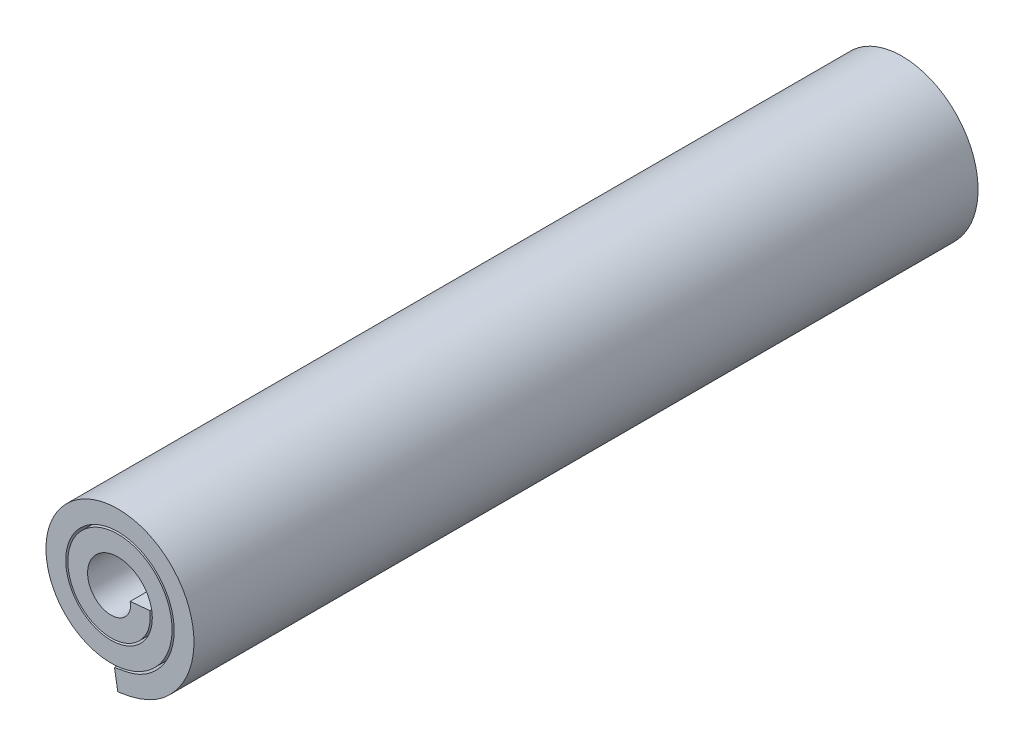
ISO-10303-21;
HEADER;
FILE_DESCRIPTION(('STEP AP214'),'2;1');
FILE_NAME('part.step','',(''),(''),'','','');
FILE_SCHEMA(('AUTOMOTIVE_DESIGN { 1 0 10303 214 1 1 1 1 }'));
ENDSEC;
DATA;
#1=APPLICATION_CONTEXT('core data for automotive mechanical design processes');
#2=APPLICATION_PROTOCOL_DEFINITION('international standard','automotive_design',2000,#1);
#3=PRODUCT_CONTEXT('',#1,'mechanical');
#4=PRODUCT('Part','Part','',(#3));
#5=PRODUCT_RELATED_PRODUCT_CATEGORY('part','',(#4));
#6=PRODUCT_DEFINITION_FORMATION('','',#4);
#7=PRODUCT_DEFINITION_CONTEXT('part definition',#1,'design');
#8=PRODUCT_DEFINITION('design','',#6,#7);
#9=PRODUCT_DEFINITION_SHAPE('','',#8);
#10=(LENGTH_UNIT() NAMED_UNIT(*) SI_UNIT(.MILLI.,.METRE.));
#11=(NAMED_UNIT(*) PLANE_ANGLE_UNIT() SI_UNIT($,.RADIAN.));
#12=(NAMED_UNIT(*) SI_UNIT($,.STERADIAN.) SOLID_ANGLE_UNIT());
#13=UNCERTAINTY_MEASURE_WITH_UNIT(LENGTH_MEASURE(1.E-05),#10,'distance_accuracy_value','');
#14=(GEOMETRIC_REPRESENTATION_CONTEXT(3) GLOBAL_UNCERTAINTY_ASSIGNED_CONTEXT((#13)) GLOBAL_UNIT_ASSIGNED_CONTEXT((#10,
#11,#12)) REPRESENTATION_CONTEXT('',''));
#15=CARTESIAN_POINT('',(0.,0.,0.));
#16=DIRECTION('',(0.,0.,1.));
#17=DIRECTION('',(1.,0.,0.));
#18=AXIS2_PLACEMENT_3D('',#15,#16,#17);
#19=CARTESIAN_POINT('',(0.499999999999983,0.,0.));
#20=DIRECTION('',(0.0937922385048884,-0.995591791848568,0.));
#21=DIRECTION('',(0.995591791848568,0.0937922385048885,0.));
#22=AXIS2_PLACEMENT_3D('',#19,#20,#21);
#23=PLANE('',#22);
#24=DIRECTION('',(-0.995591791848568,-0.0937922385048885,0.));
#25=VECTOR('',#24,1.);
#26=CARTESIAN_POINT('',(1.12722282886458,0.0590891102580785,0.));
#27=LINE('',#26,#25);
#28=CARTESIAN_POINT('',(1.12722282886458,0.0590891102580785,0.));
#29=VERTEX_POINT('',#28);
#30=CARTESIAN_POINT('',(0.499999999999983,0.,0.));
#31=VERTEX_POINT('',#30);
#32=EDGE_CURVE('E76',#29,#31,#27,.T.);
#33=ORIENTED_EDGE('',*,*,#32,.F.);
#34=DIRECTION('',(0.,0.,1.));
#35=VECTOR('',#34,1.);
#36=CARTESIAN_POINT('',(1.12722282886459,0.0590891102580791,-25.));
#37=LINE('',#36,#35);
#38=CARTESIAN_POINT('',(1.12722282886459,0.0590891102580791,-25.));
#39=VERTEX_POINT('',#38);
#40=EDGE_CURVE('E102',#39,#29,#37,.T.);
#41=ORIENTED_EDGE('',*,*,#40,.F.);
#42=DIRECTION('',(0.995591791848568,0.0937922385048885,0.));
#43=VECTOR('',#42,1.);
#44=CARTESIAN_POINT('',(0.499999999999986,0.,-25.));
#45=LINE('',#44,#43);
#46=CARTESIAN_POINT('',(0.499999999999986,0.,-25.));
#47=VERTEX_POINT('',#46);
#48=EDGE_CURVE('E77',#47,#39,#45,.T.);
#49=ORIENTED_EDGE('',*,*,#48,.F.);
#50=DIRECTION('',(0.,0.,-1.));
#51=VECTOR('',#50,1.);
#52=CARTESIAN_POINT('',(0.499999999999983,0.,0.));
#53=LINE('',#52,#51);
#54=EDGE_CURVE('E74',#31,#47,#53,.T.);
#55=ORIENTED_EDGE('',*,*,#54,.F.);
#56=EDGE_LOOP('',(#33,#41,#49,#55));
#57=FACE_BOUND('',#56,.T.);
#58=ADVANCED_FACE('F33',(#57),#23,.F.);
#59=CARTESIAN_POINT('',(0.,-2.075,0.));
#60=DIRECTION('',(-0.986101513551397,-0.166143928482638,0.));
#61=DIRECTION('',(0.166143928482638,-0.986101513551397,0.));
#62=AXIS2_PLACEMENT_3D('',#59,#60,#61);
#63=PLANE('',#62);
#64=DIRECTION('',(-0.166143928482638,0.986101513551397,0.));
#65=VECTOR('',#64,1.);
#66=CARTESIAN_POINT('',(0.104670674943996,-2.69624395353738,0.));
#67=LINE('',#66,#65);
#68=CARTESIAN_POINT('',(0.104670674943996,-2.69624395353738,0.));
#69=VERTEX_POINT('',#68);
#70=CARTESIAN_POINT('',(0.,-2.075,0.));
#71=VERTEX_POINT('',#70);
#72=EDGE_CURVE('E93',#69,#71,#67,.T.);
#73=ORIENTED_EDGE('',*,*,#72,.T.);
#74=DIRECTION('',(0.,0.,-1.));
#75=VECTOR('',#74,1.);
#76=CARTESIAN_POINT('',(0.,-2.075,0.));
#77=LINE('',#76,#75);
#78=CARTESIAN_POINT('',(0.,-2.075,-25.));
#79=VERTEX_POINT('',#78);
#80=EDGE_CURVE('E92',#71,#79,#77,.T.);
#81=ORIENTED_EDGE('',*,*,#80,.T.);
#82=DIRECTION('',(0.166143928482638,-0.986101513551397,0.));
#83=VECTOR('',#82,1.);
#84=CARTESIAN_POINT('',(0.,-2.075,-25.));
#85=LINE('',#84,#83);
#86=CARTESIAN_POINT('',(0.104670674943997,-2.69624395353738,-25.));
#87=VERTEX_POINT('',#86);
#88=EDGE_CURVE('E41',#79,#87,#85,.T.);
#89=ORIENTED_EDGE('',*,*,#88,.T.);
#90=DIRECTION('',(0.,0.,1.));
#91=VECTOR('',#90,1.);
#92=CARTESIAN_POINT('',(0.104670674943997,-2.69624395353738,-25.));
#93=LINE('',#92,#91);
#94=EDGE_CURVE('E11',#87,#69,#93,.T.);
#95=ORIENTED_EDGE('',*,*,#94,.T.);
#96=EDGE_LOOP('',(#73,#81,#89,#95));
#97=FACE_BOUND('',#96,.T.);
#98=ADVANCED_FACE('F124',(#97),#63,.T.);
#99=CARTESIAN_POINT('',(0.,-2.075,-25.));
#100=CARTESIAN_POINT('',(0.191979122898397,-2.04255455965042,-25.));
#101=CARTESIAN_POINT('',(0.58961328567229,-1.97535237998395,-25.));
#102=CARTESIAN_POINT('',(1.02373521008562,-1.76587334130241,-25.));
#103=CARTESIAN_POINT('',(1.36271708763674,-1.46938130820576,-25.));
#104=CARTESIAN_POINT('',(1.60114532698387,-1.16725818916722,-25.));
#105=CARTESIAN_POINT('',(1.77767549349336,-0.828162738983051,-25.));
#106=CARTESIAN_POINT('',(1.88353579986627,-0.461601955854315,-25.));
#107=CARTESIAN_POINT('',(1.91582688563732,-0.0796298419358635,-25.));
#108=CARTESIAN_POINT('',(1.87108564136869,0.300170476217156,-25.));
#109=CARTESIAN_POINT('',(1.75113198425042,0.664044844493022,-25.));
#110=CARTESIAN_POINT('',(1.55929323721311,0.995038924615031,-25.));
#111=CARTESIAN_POINT('',(1.30782497665277,1.27541359816311,-25.));
#112=CARTESIAN_POINT('',(1.00973898516544,1.49401115992098,-25.));
#113=CARTESIAN_POINT('',(0.679842236066423,1.646303293234,-25.));
#114=CARTESIAN_POINT('',(0.32554667187205,1.72768846616353,-25.));
#115=CARTESIAN_POINT('',(-0.0375967611253286,1.73502012248365,-25.));
#116=CARTESIAN_POINT('',(-0.394812969400935,1.66564946311879,-25.));
#117=CARTESIAN_POINT('',(-0.728719505577525,1.52307552409814,-25.));
#118=CARTESIAN_POINT('',(-1.02498854097518,1.31118729727892,-25.));
#119=CARTESIAN_POINT('',(-1.2673785196567,1.04090383805359,-25.));
#120=CARTESIAN_POINT('',(-1.4447764371545,0.722605765512491,-25.));
#121=CARTESIAN_POINT('',(-1.54568612342397,0.373516329412341,-25.));
#122=CARTESIAN_POINT('',(-1.56495600184155,0.00990192243496311,-25.));
#123=CARTESIAN_POINT('',(-1.49890885612183,-0.348208696749193,-25.));
#124=CARTESIAN_POINT('',(-1.3510166382196,-0.680450051108161,-25.));
#125=CARTESIAN_POINT('',(-1.12703268379356,-0.968329706167473,-25.));
#126=CARTESIAN_POINT('',(-0.840084356061241,-1.19222550202165,-25.));
#127=CARTESIAN_POINT('',(-0.518616821228081,-1.33296092165241,-25.));
#128=CARTESIAN_POINT('',(-0.186265382380022,-1.3898134184995,-25.));
#129=CARTESIAN_POINT('',(0.13612784101064,-1.36991499199628,-25.));
#130=CARTESIAN_POINT('',(0.446010939695411,-1.27479571716864,-25.));
#131=CARTESIAN_POINT('',(0.723489519581017,-1.10846763766277,-25.));
#132=CARTESIAN_POINT('',(0.9525561064144,-0.87989695834652,-25.));
#133=CARTESIAN_POINT('',(1.09930717348759,-0.631364308233585,-25.));
#134=CARTESIAN_POINT('',(1.1780064829771,-0.394234023272569,-25.));
#135=CARTESIAN_POINT('',(1.20933515031558,-0.180929964689105,-25.));
#136=CARTESIAN_POINT('',(1.20292118446566,0.0336389222108388,-25.));
#137=CARTESIAN_POINT('',(1.15779787971842,0.244243900690417,-25.));
#138=CARTESIAN_POINT('',(1.07559561113039,0.442950234088985,-25.));
#139=CARTESIAN_POINT('',(0.95766948520535,0.622915972216931,-25.));
#140=CARTESIAN_POINT('',(0.808103322363776,0.77784487510924,-25.));
#141=CARTESIAN_POINT('',(0.631572598318882,0.900723440908225,-25.));
#142=CARTESIAN_POINT('',(0.434188243948875,0.987205940567142,-25.));
#143=CARTESIAN_POINT('',(0.223716889389367,1.03207470783211,-25.));
#144=CARTESIAN_POINT('',(0.00823158804945417,1.03349756069774,-25.));
#145=CARTESIAN_POINT('',(-0.202761615892395,0.989540183770991,-25.));
#146=CARTESIAN_POINT('',(-0.399494567552331,0.902054563227515,-25.));
#147=CARTESIAN_POINT('',(-0.57269823512236,0.772989140378816,-25.));
#148=CARTESIAN_POINT('',(-0.712213560391472,0.609184013537867,-25.));
#149=CARTESIAN_POINT('',(-0.810748832016377,0.416604568011872,-25.));
#150=CARTESIAN_POINT('',(-0.860565152233857,0.206973374233351,-25.));
#151=CARTESIAN_POINT('',(-0.858242328116945,0.00891915237071739,-25.));
#152=CARTESIAN_POINT('',(-0.81637488832565,-0.165288586283552,-25.));
#153=CARTESIAN_POINT('',(-0.749146681453405,-0.312053021141878,-25.));
#154=CARTESIAN_POINT('',(-0.653528465640274,-0.442450130732647,-25.));
#155=CARTESIAN_POINT('',(-0.53357400078122,-0.550448501430655,-25.));
#156=CARTESIAN_POINT('',(-0.392802707917104,-0.630631809759926,-25.));
#157=CARTESIAN_POINT('',(-0.238595536919297,-0.678166334330086,-25.));
#158=CARTESIAN_POINT('',(-0.0766809237945586,-0.689524408301166,-25.));
#159=CARTESIAN_POINT('',(0.0767071343405846,-0.663702847433186,-25.));
#160=CARTESIAN_POINT('',(0.215110670857113,-0.605499036500482,-25.));
#161=CARTESIAN_POINT('',(0.330225942184191,-0.521750258554842,-25.));
#162=CARTESIAN_POINT('',(0.425885474129058,-0.411109801634576,-25.));
#163=CARTESIAN_POINT('',(0.491924437399513,-0.277027383794773,-25.));
#164=CARTESIAN_POINT('',(0.513688780798657,-0.163769779584466,-25.));
#165=CARTESIAN_POINT('',(0.504189194007997,-0.0501186620940827,-25.));
#166=CARTESIAN_POINT('',(0.499999999999986,0.,-25.));
#167=CARTESIAN_POINT('',(0.,-2.075,0.));
#168=CARTESIAN_POINT('',(0.191979122898397,-2.04255455965042,0.));
#169=CARTESIAN_POINT('',(0.589613285672289,-1.97535237998394,0.));
#170=CARTESIAN_POINT('',(1.02373521008562,-1.7658733413024,0.));
#171=CARTESIAN_POINT('',(1.36271708763674,-1.46938130820576,0.));
#172=CARTESIAN_POINT('',(1.60114532698387,-1.16725818916722,0.));
#173=CARTESIAN_POINT('',(1.77767549349335,-0.82816273898305,0.));
#174=CARTESIAN_POINT('',(1.88353579986627,-0.461601955854315,0.));
#175=CARTESIAN_POINT('',(1.91582688563732,-0.0796298419358634,0.));
#176=CARTESIAN_POINT('',(1.87108564136868,0.300170476217155,0.));
#177=CARTESIAN_POINT('',(1.75113198425042,0.664044844493021,0.));
#178=CARTESIAN_POINT('',(1.5592932372131,0.995038924615029,0.));
#179=CARTESIAN_POINT('',(1.30782497665277,1.27541359816311,0.));
#180=CARTESIAN_POINT('',(1.00973898516544,1.49401115992097,0.));
#181=CARTESIAN_POINT('',(0.679842236066422,1.64630329323399,0.));
#182=CARTESIAN_POINT('',(0.325546671872049,1.72768846616353,0.));
#183=CARTESIAN_POINT('',(-0.0375967611253284,1.73502012248365,0.));
#184=CARTESIAN_POINT('',(-0.394812969400934,1.66564946311879,0.));
#185=CARTESIAN_POINT('',(-0.728719505577523,1.52307552409814,0.));
#186=CARTESIAN_POINT('',(-1.02498854097518,1.31118729727892,0.));
#187=CARTESIAN_POINT('',(-1.2673785196567,1.04090383805359,0.));
#188=CARTESIAN_POINT('',(-1.4447764371545,0.72260576551249,0.));
#189=CARTESIAN_POINT('',(-1.54568612342397,0.373516329412341,0.));
#190=CARTESIAN_POINT('',(-1.56495600184155,0.0099019224349633,0.));
#191=CARTESIAN_POINT('',(-1.49890885612182,-0.348208696749192,0.));
#192=CARTESIAN_POINT('',(-1.3510166382196,-0.68045005110816,0.));
#193=CARTESIAN_POINT('',(-1.12703268379356,-0.968329706167471,0.));
#194=CARTESIAN_POINT('',(-0.840084356061239,-1.19222550202165,0.));
#195=CARTESIAN_POINT('',(-0.518616821228081,-1.3329609216524,0.));
#196=CARTESIAN_POINT('',(-0.186265382380021,-1.3898134184995,0.));
#197=CARTESIAN_POINT('',(0.136127841010639,-1.36991499199628,0.));
#198=CARTESIAN_POINT('',(0.446010939695409,-1.27479571716864,0.));
#199=CARTESIAN_POINT('',(0.723489519581015,-1.10846763766276,0.));
#200=CARTESIAN_POINT('',(0.952556106414397,-0.879896958346519,0.));
#201=CARTESIAN_POINT('',(1.09930717348759,-0.631364308233584,0.));
#202=CARTESIAN_POINT('',(1.1780064829771,-0.394234023272569,0.));
#203=CARTESIAN_POINT('',(1.20933515031558,-0.180929964689105,0.));
#204=CARTESIAN_POINT('',(1.20292118446566,0.0336389222108384,0.));
#205=CARTESIAN_POINT('',(1.15779787971842,0.244243900690416,0.));
#206=CARTESIAN_POINT('',(1.07559561113039,0.442950234088984,0.));
#207=CARTESIAN_POINT('',(0.957669485205348,0.622915972216929,0.));
#208=CARTESIAN_POINT('',(0.808103322363774,0.777844875109238,0.));
#209=CARTESIAN_POINT('',(0.63157259831888,0.900723440908222,0.));
#210=CARTESIAN_POINT('',(0.434188243948874,0.987205940567139,0.));
#211=CARTESIAN_POINT('',(0.223716889389367,1.03207470783211,0.));
#212=CARTESIAN_POINT('',(0.00823158804945449,1.03349756069774,0.));
#213=CARTESIAN_POINT('',(-0.202761615892394,0.989540183770988,0.));
#214=CARTESIAN_POINT('',(-0.399494567552329,0.902054563227512,0.));
#215=CARTESIAN_POINT('',(-0.572698235122358,0.772989140378814,0.));
#216=CARTESIAN_POINT('',(-0.71221356039147,0.609184013537866,0.));
#217=CARTESIAN_POINT('',(-0.810748832016374,0.41660456801187,0.));
#218=CARTESIAN_POINT('',(-0.860565152233854,0.20697337423335,0.));
#219=CARTESIAN_POINT('',(-0.858242328116942,0.00891915237071773,0.));
#220=CARTESIAN_POINT('',(-0.816374888325647,-0.165288586283551,0.));
#221=CARTESIAN_POINT('',(-0.749146681453402,-0.312053021141876,0.));
#222=CARTESIAN_POINT('',(-0.653528465640271,-0.442450130732645,0.));
#223=CARTESIAN_POINT('',(-0.533574000781219,-0.550448501430653,0.));
#224=CARTESIAN_POINT('',(-0.392802707917103,-0.630631809759923,0.));
#225=CARTESIAN_POINT('',(-0.238595536919296,-0.678166334330083,0.));
#226=CARTESIAN_POINT('',(-0.0766809237945586,-0.689524408301163,0.));
#227=CARTESIAN_POINT('',(0.0767071343405838,-0.663702847433183,0.));
#228=CARTESIAN_POINT('',(0.215110670857111,-0.605499036500478,0.));
#229=CARTESIAN_POINT('',(0.330225942184189,-0.52175025855484,0.));
#230=CARTESIAN_POINT('',(0.425885474129055,-0.411109801634575,0.));
#231=CARTESIAN_POINT('',(0.491924437399511,-0.277027383794771,0.));
#232=CARTESIAN_POINT('',(0.513688780798654,-0.163769779584466,0.));
#233=CARTESIAN_POINT('',(0.504189194007994,-0.050118662094083,0.));
#234=CARTESIAN_POINT('',(0.499999999999983,0.,0.));
#235=B_SPLINE_SURFACE_WITH_KNOTS('',1,3,((#99,#100,#101,#102,#103,#104,#105,#106,#107,#108,#109,
#110,#111,#112,#113,#114,#115,#116,#117,#118,#119,#120,#121,#122,#123,#124,#125,#126,#127,#128,
#129,#130,#131,#132,#133,#134,#135,#136,#137,#138,#139,#140,#141,#142,#143,#144,#145,#146,#147,
#148,#149,#150,#151,#152,#153,#154,#155,#156,#157,#158,#159,#160,#161,#162,#163,#164,#165,#166),
(#167,#168,#169,#170,#171,#172,#173,#174,#175,#176,#177,#178,#179,#180,#181,#182,#183,#184,#185,
#186,#187,#188,#189,#190,#191,#192,#193,#194,#195,#196,#197,#198,#199,#200,#201,#202,#203,#204,
#205,#206,#207,#208,#209,#210,#211,#212,#213,#214,#215,#216,#217,#218,#219,#220,#221,#222,#223,
#224,#225,#226,#227,#228,#229,#230,#231,#232,#233,#234)),.UNSPECIFIED.,.F.,.F.,.F.,(2,2),(4,1,1,
1,1,1,1,1,1,1,1,1,1,1,1,1,1,1,1,1,1,1,1,1,1,1,1,1,1,1,1,1,1,1,1,1,1,1,1,1,1,1,1,1,1,1,1,1,1,1,1,
1,1,1,1,1,1,1,1,1,1,1,1,1,1,4),(0.512290284822474,1.),(0.,0.0276569759900053,0.0572841376010448,
0.0770949744957778,0.0967597680103298,0.116415852282449,0.136148048198849,0.155909148840344,
0.175705715870728,0.195509397802657,0.215352550148176,0.235219213079138,0.254113940035531,
0.273033783418019,0.291983749686718,0.310967613632046,0.32997661067976,0.349029878285721,
0.368102917991534,0.387230030820004,0.406376032697237,0.425579888296524,0.444813728221296,
0.464094704110151,0.483429294655977,0.502795548731436,0.522230214549338,0.541713456634357,
0.559082357396024,0.576515108363195,0.593980454966659,0.611515722392399,0.629105647751169,
0.646745443333069,0.658575807940051,0.670418854043581,0.682308775655792,0.694223222117301,
0.706177566782933,0.718171192783669,0.730199913918089,0.742278717618551,0.75439386335455,
0.766565271773404,0.778780945688554,0.791054534540864,0.803388394676819,0.815776095406598,
0.828245582709591,0.840769254156808,0.853391352253893,0.86609111072931,0.875689655898569,
0.885348695848098,0.895070773671186,0.904865877022695,0.914729592397221,0.924686066490103,
0.93472054206472,0.944880728702389,0.953998873927047,0.963220386755095,0.97247748227852,
0.982095296293533,0.992104258939337,1.),.UNSPECIFIED.);
#236=CARTESIAN_POINT('',(0.,-2.075,0.));
#237=CARTESIAN_POINT('',(0.191979122898397,-2.04255455965042,0.));
#238=CARTESIAN_POINT('',(0.58961328567229,-1.97535237998394,0.));
#239=CARTESIAN_POINT('',(1.02373521008562,-1.7658733413024,0.));
#240=CARTESIAN_POINT('',(1.36271708763674,-1.46938130820576,0.));
#241=CARTESIAN_POINT('',(1.60114532698387,-1.16725818916722,0.));
#242=CARTESIAN_POINT('',(1.77767549349335,-0.82816273898305,0.));
#243=CARTESIAN_POINT('',(1.88353579986627,-0.461601955854315,0.));
#244=CARTESIAN_POINT('',(1.91582688563732,-0.0796298419358634,0.));
#245=CARTESIAN_POINT('',(1.87108564136868,0.300170476217155,0.));
#246=CARTESIAN_POINT('',(1.75113198425042,0.664044844493021,0.));
#247=CARTESIAN_POINT('',(1.5592932372131,0.995038924615029,0.));
#248=CARTESIAN_POINT('',(1.30782497665277,1.27541359816311,0.));
#249=CARTESIAN_POINT('',(1.00973898516544,1.49401115992097,0.));
#250=CARTESIAN_POINT('',(0.679842236066422,1.64630329323399,0.));
#251=CARTESIAN_POINT('',(0.325546671872049,1.72768846616353,0.));
#252=CARTESIAN_POINT('',(-0.0375967611253284,1.73502012248365,0.));
#253=CARTESIAN_POINT('',(-0.394812969400934,1.66564946311879,0.));
#254=CARTESIAN_POINT('',(-0.728719505577523,1.52307552409814,0.));
#255=CARTESIAN_POINT('',(-1.02498854097518,1.31118729727892,0.));
#256=CARTESIAN_POINT('',(-1.2673785196567,1.04090383805359,0.));
#257=CARTESIAN_POINT('',(-1.4447764371545,0.72260576551249,0.));
#258=CARTESIAN_POINT('',(-1.54568612342397,0.373516329412341,0.));
#259=CARTESIAN_POINT('',(-1.56495600184155,0.0099019224349633,0.));
#260=CARTESIAN_POINT('',(-1.49890885612182,-0.348208696749192,0.));
#261=CARTESIAN_POINT('',(-1.3510166382196,-0.68045005110816,0.));
#262=CARTESIAN_POINT('',(-1.12703268379356,-0.968329706167471,0.));
#263=CARTESIAN_POINT('',(-0.840084356061239,-1.19222550202165,0.));
#264=CARTESIAN_POINT('',(-0.518616821228081,-1.3329609216524,0.));
#265=CARTESIAN_POINT('',(-0.186265382380021,-1.3898134184995,0.));
#266=CARTESIAN_POINT('',(0.136127841010639,-1.36991499199628,0.));
#267=CARTESIAN_POINT('',(0.446010939695409,-1.27479571716864,0.));
#268=CARTESIAN_POINT('',(0.723489519581015,-1.10846763766276,0.));
#269=CARTESIAN_POINT('',(0.952556106414397,-0.879896958346518,0.));
#270=CARTESIAN_POINT('',(1.09930717348759,-0.631364308233584,0.));
#271=CARTESIAN_POINT('',(1.1780064829771,-0.394234023272569,0.));
#272=CARTESIAN_POINT('',(1.20933515031558,-0.180929964689105,0.));
#273=CARTESIAN_POINT('',(1.20292118446566,0.0336389222108385,0.));
#274=CARTESIAN_POINT('',(1.15779787971842,0.244243900690416,0.));
#275=CARTESIAN_POINT('',(1.07559561113039,0.442950234088984,0.));
#276=CARTESIAN_POINT('',(0.957669485205348,0.622915972216929,0.));
#277=CARTESIAN_POINT('',(0.808103322363774,0.777844875109238,0.));
#278=CARTESIAN_POINT('',(0.63157259831888,0.900723440908222,0.));
#279=CARTESIAN_POINT('',(0.434188243948874,0.987205940567139,0.));
#280=CARTESIAN_POINT('',(0.223716889389367,1.03207470783211,0.));
#281=CARTESIAN_POINT('',(0.00823158804945449,1.03349756069774,0.));
#282=CARTESIAN_POINT('',(-0.202761615892394,0.989540183770988,0.));
#283=CARTESIAN_POINT('',(-0.399494567552329,0.902054563227512,0.));
#284=CARTESIAN_POINT('',(-0.572698235122358,0.772989140378814,0.));
#285=CARTESIAN_POINT('',(-0.71221356039147,0.609184013537866,0.));
#286=CARTESIAN_POINT('',(-0.810748832016374,0.41660456801187,0.));
#287=CARTESIAN_POINT('',(-0.860565152233854,0.20697337423335,0.));
#288=CARTESIAN_POINT('',(-0.858242328116942,0.00891915237071772,0.));
#289=CARTESIAN_POINT('',(-0.816374888325647,-0.165288586283551,0.));
#290=CARTESIAN_POINT('',(-0.749146681453402,-0.312053021141876,0.));
#291=CARTESIAN_POINT('',(-0.653528465640271,-0.442450130732645,0.));
#292=CARTESIAN_POINT('',(-0.533574000781219,-0.550448501430653,0.));
#293=CARTESIAN_POINT('',(-0.392802707917103,-0.630631809759923,0.));
#294=CARTESIAN_POINT('',(-0.238595536919296,-0.678166334330083,0.));
#295=CARTESIAN_POINT('',(-0.0766809237945586,-0.689524408301163,0.));
#296=CARTESIAN_POINT('',(0.0767071343405837,-0.663702847433183,0.));
#297=CARTESIAN_POINT('',(0.215110670857111,-0.605499036500478,0.));
#298=CARTESIAN_POINT('',(0.330225942184189,-0.52175025855484,0.));
#299=CARTESIAN_POINT('',(0.425885474129055,-0.411109801634575,0.));
#300=CARTESIAN_POINT('',(0.491924437399511,-0.277027383794771,0.));
#301=CARTESIAN_POINT('',(0.513688780798654,-0.163769779584466,0.));
#302=CARTESIAN_POINT('',(0.504189194007994,-0.0501186620940829,0.));
#303=CARTESIAN_POINT('',(0.499999999999983,0.,0.));
#304=B_SPLINE_CURVE_WITH_KNOTS('',3,(#236,#237,#238,#239,#240,#241,#242,#243,#244,#245,#246,
#247,#248,#249,#250,#251,#252,#253,#254,#255,#256,#257,#258,#259,#260,#261,#262,#263,#264,#265,
#266,#267,#268,#269,#270,#271,#272,#273,#274,#275,#276,#277,#278,#279,#280,#281,#282,#283,#284,
#285,#286,#287,#288,#289,#290,#291,#292,#293,#294,#295,#296,#297,#298,#299,#300,#301,#302,#303),
.UNSPECIFIED.,.F.,.F.,(4,1,1,1,1,1,1,1,1,1,1,1,1,1,1,1,1,1,1,1,1,1,1,1,1,1,1,1,1,1,1,1,1,1,1,1,
1,1,1,1,1,1,1,1,1,1,1,1,1,1,1,1,1,1,1,1,1,1,1,1,1,1,1,1,1,4),(0.,0.0276569759900053,
0.0572841376010448,0.0770949744957778,0.0967597680103298,0.116415852282449,0.136148048198849,
0.155909148840344,0.175705715870728,0.195509397802657,0.215352550148176,0.235219213079138,
0.254113940035531,0.273033783418019,0.291983749686718,0.310967613632046,0.32997661067976,
0.349029878285721,0.368102917991534,0.387230030820004,0.406376032697237,0.425579888296524,
0.444813728221296,0.464094704110151,0.483429294655977,0.502795548731436,0.522230214549338,
0.541713456634357,0.559082357396024,0.576515108363195,0.593980454966659,0.611515722392399,
0.629105647751169,0.646745443333069,0.658575807940051,0.670418854043581,0.682308775655792,
0.694223222117301,0.706177566782933,0.718171192783669,0.730199913918089,0.742278717618551,
0.75439386335455,0.766565271773404,0.778780945688554,0.791054534540864,0.803388394676819,
0.815776095406598,0.828245582709591,0.840769254156808,0.853391352253893,0.86609111072931,
0.875689655898569,0.885348695848098,0.895070773671186,0.904865877022695,0.914729592397221,
0.924686066490103,0.93472054206472,0.944880728702389,0.953998873927047,0.963220386755095,
0.97247748227852,0.982095296293533,0.992104258939337,1.),.UNSPECIFIED.);
#305=EDGE_CURVE('E85',#71,#31,#304,.T.);
#306=CARTESIAN_POINT('',(0.,-2.075,-25.));
#307=CARTESIAN_POINT('',(0.191979122898397,-2.04255455965042,-25.));
#308=CARTESIAN_POINT('',(0.58961328567229,-1.97535237998395,-25.));
#309=CARTESIAN_POINT('',(1.02373521008562,-1.76587334130241,-25.));
#310=CARTESIAN_POINT('',(1.36271708763674,-1.46938130820576,-25.));
#311=CARTESIAN_POINT('',(1.60114532698387,-1.16725818916722,-25.));
#312=CARTESIAN_POINT('',(1.77767549349336,-0.828162738983051,-25.));
#313=CARTESIAN_POINT('',(1.88353579986627,-0.461601955854315,-25.));
#314=CARTESIAN_POINT('',(1.91582688563732,-0.0796298419358635,-25.));
#315=CARTESIAN_POINT('',(1.87108564136869,0.300170476217156,-25.));
#316=CARTESIAN_POINT('',(1.75113198425042,0.664044844493022,-25.));
#317=CARTESIAN_POINT('',(1.55929323721311,0.995038924615031,-25.));
#318=CARTESIAN_POINT('',(1.30782497665277,1.27541359816311,-25.));
#319=CARTESIAN_POINT('',(1.00973898516544,1.49401115992098,-25.));
#320=CARTESIAN_POINT('',(0.679842236066423,1.646303293234,-25.));
#321=CARTESIAN_POINT('',(0.32554667187205,1.72768846616353,-25.));
#322=CARTESIAN_POINT('',(-0.0375967611253286,1.73502012248365,-25.));
#323=CARTESIAN_POINT('',(-0.394812969400935,1.66564946311879,-25.));
#324=CARTESIAN_POINT('',(-0.728719505577525,1.52307552409814,-25.));
#325=CARTESIAN_POINT('',(-1.02498854097518,1.31118729727892,-25.));
#326=CARTESIAN_POINT('',(-1.2673785196567,1.04090383805359,-25.));
#327=CARTESIAN_POINT('',(-1.4447764371545,0.722605765512491,-25.));
#328=CARTESIAN_POINT('',(-1.54568612342397,0.373516329412341,-25.));
#329=CARTESIAN_POINT('',(-1.56495600184155,0.00990192243496311,-25.));
#330=CARTESIAN_POINT('',(-1.49890885612183,-0.348208696749193,-25.));
#331=CARTESIAN_POINT('',(-1.3510166382196,-0.680450051108161,-25.));
#332=CARTESIAN_POINT('',(-1.12703268379356,-0.968329706167473,-25.));
#333=CARTESIAN_POINT('',(-0.840084356061241,-1.19222550202165,-25.));
#334=CARTESIAN_POINT('',(-0.518616821228081,-1.33296092165241,-25.));
#335=CARTESIAN_POINT('',(-0.186265382380022,-1.3898134184995,-25.));
#336=CARTESIAN_POINT('',(0.13612784101064,-1.36991499199628,-25.));
#337=CARTESIAN_POINT('',(0.446010939695411,-1.27479571716864,-25.));
#338=CARTESIAN_POINT('',(0.723489519581017,-1.10846763766277,-25.));
#339=CARTESIAN_POINT('',(0.9525561064144,-0.87989695834652,-25.));
#340=CARTESIAN_POINT('',(1.09930717348759,-0.631364308233585,-25.));
#341=CARTESIAN_POINT('',(1.1780064829771,-0.394234023272569,-25.));
#342=CARTESIAN_POINT('',(1.20933515031558,-0.180929964689105,-25.));
#343=CARTESIAN_POINT('',(1.20292118446566,0.0336389222108388,-25.));
#344=CARTESIAN_POINT('',(1.15779787971842,0.244243900690417,-25.));
#345=CARTESIAN_POINT('',(1.07559561113039,0.442950234088985,-25.));
#346=CARTESIAN_POINT('',(0.95766948520535,0.622915972216931,-25.));
#347=CARTESIAN_POINT('',(0.808103322363776,0.77784487510924,-25.));
#348=CARTESIAN_POINT('',(0.631572598318882,0.900723440908225,-25.));
#349=CARTESIAN_POINT('',(0.434188243948875,0.987205940567142,-25.));
#350=CARTESIAN_POINT('',(0.223716889389367,1.03207470783211,-25.));
#351=CARTESIAN_POINT('',(0.00823158804945417,1.03349756069774,-25.));
#352=CARTESIAN_POINT('',(-0.202761615892395,0.989540183770991,-25.));
#353=CARTESIAN_POINT('',(-0.399494567552331,0.902054563227515,-25.));
#354=CARTESIAN_POINT('',(-0.57269823512236,0.772989140378816,-25.));
#355=CARTESIAN_POINT('',(-0.712213560391472,0.609184013537867,-25.));
#356=CARTESIAN_POINT('',(-0.810748832016377,0.416604568011872,-25.));
#357=CARTESIAN_POINT('',(-0.860565152233857,0.206973374233351,-25.));
#358=CARTESIAN_POINT('',(-0.858242328116945,0.00891915237071739,-25.));
#359=CARTESIAN_POINT('',(-0.81637488832565,-0.165288586283552,-25.));
#360=CARTESIAN_POINT('',(-0.749146681453405,-0.312053021141878,-25.));
#361=CARTESIAN_POINT('',(-0.653528465640274,-0.442450130732647,-25.));
#362=CARTESIAN_POINT('',(-0.53357400078122,-0.550448501430655,-25.));
#363=CARTESIAN_POINT('',(-0.392802707917104,-0.630631809759926,-25.));
#364=CARTESIAN_POINT('',(-0.238595536919297,-0.678166334330086,-25.));
#365=CARTESIAN_POINT('',(-0.0766809237945586,-0.689524408301166,-25.));
#366=CARTESIAN_POINT('',(0.0767071343405846,-0.663702847433186,-25.));
#367=CARTESIAN_POINT('',(0.215110670857113,-0.605499036500482,-25.));
#368=CARTESIAN_POINT('',(0.330225942184191,-0.521750258554842,-25.));
#369=CARTESIAN_POINT('',(0.425885474129058,-0.411109801634576,-25.));
#370=CARTESIAN_POINT('',(0.491924437399513,-0.277027383794773,-25.));
#371=CARTESIAN_POINT('',(0.513688780798657,-0.163769779584466,-25.));
#372=CARTESIAN_POINT('',(0.504189194007997,-0.0501186620940827,-25.));
#373=CARTESIAN_POINT('',(0.499999999999986,0.,-25.));
#374=B_SPLINE_CURVE_WITH_KNOTS('',3,(#306,#307,#308,#309,#310,#311,#312,#313,#314,#315,#316,
#317,#318,#319,#320,#321,#322,#323,#324,#325,#326,#327,#328,#329,#330,#331,#332,#333,#334,#335,
#336,#337,#338,#339,#340,#341,#342,#343,#344,#345,#346,#347,#348,#349,#350,#351,#352,#353,#354,
#355,#356,#357,#358,#359,#360,#361,#362,#363,#364,#365,#366,#367,#368,#369,#370,#371,#372,#373),
.UNSPECIFIED.,.F.,.F.,(4,1,1,1,1,1,1,1,1,1,1,1,1,1,1,1,1,1,1,1,1,1,1,1,1,1,1,1,1,1,1,1,1,1,1,1,
1,1,1,1,1,1,1,1,1,1,1,1,1,1,1,1,1,1,1,1,1,1,1,1,1,1,1,1,1,4),(0.,0.0276569759900053,
0.0572841376010448,0.0770949744957778,0.0967597680103298,0.116415852282449,0.136148048198849,
0.155909148840344,0.175705715870728,0.195509397802657,0.215352550148176,0.235219213079138,
0.254113940035531,0.273033783418019,0.291983749686718,0.310967613632046,0.32997661067976,
0.349029878285721,0.368102917991534,0.387230030820004,0.406376032697237,0.425579888296524,
0.444813728221296,0.464094704110151,0.483429294655977,0.502795548731436,0.522230214549338,
0.541713456634357,0.559082357396024,0.576515108363195,0.593980454966659,0.611515722392399,
0.629105647751169,0.646745443333069,0.658575807940051,0.670418854043581,0.682308775655792,
0.694223222117301,0.706177566782933,0.718171192783669,0.730199913918089,0.742278717618551,
0.75439386335455,0.766565271773404,0.778780945688554,0.791054534540864,0.803388394676819,
0.815776095406598,0.828245582709591,0.840769254156808,0.853391352253893,0.86609111072931,
0.875689655898569,0.885348695848098,0.895070773671186,0.904865877022695,0.914729592397221,
0.924686066490103,0.93472054206472,0.944880728702389,0.953998873927047,0.963220386755095,
0.97247748227852,0.982095296293533,0.992104258939337,1.),.UNSPECIFIED.);
#375=EDGE_CURVE('E94',#79,#47,#374,.T.);
#376=ORIENTED_EDGE('',*,*,#80,.F.);
#377=ORIENTED_EDGE('',*,*,#305,.T.);
#378=ORIENTED_EDGE('',*,*,#54,.T.);
#379=ORIENTED_EDGE('',*,*,#375,.F.);
#380=EDGE_LOOP('',(#376,#377,#378,#379));
#381=FACE_BOUND('',#380,.T.);
#382=ADVANCED_FACE('F90',(#381),#235,.T.);
#383=CARTESIAN_POINT('',(0.104670674943997,-2.69624395353738,-25.));
#384=DIRECTION('',(0.,0.,-1.));
#385=DIRECTION('',(-0.166143928482638,0.986101513551397,0.));
#386=AXIS2_PLACEMENT_3D('',#383,#384,#385);
#387=PLANE('',#386);
#388=ORIENTED_EDGE('',*,*,#88,.F.);
#389=ORIENTED_EDGE('',*,*,#375,.T.);
#390=ORIENTED_EDGE('',*,*,#48,.T.);
#391=CARTESIAN_POINT('',(0.104670674943997,-2.69624395353738,-25.));
#392=CARTESIAN_POINT('',(0.313102709136811,-2.66280100700738,-25.));
#393=CARTESIAN_POINT('',(0.744814741988185,-2.59353275615084,-25.));
#394=CARTESIAN_POINT('',(1.38302749218008,-2.29499952223955,-25.));
#395=CARTESIAN_POINT('',(1.82113178235789,-1.90543602445656,-25.));
#396=CARTESIAN_POINT('',(2.13282142235184,-1.51252851742942,-25.));
#397=CARTESIAN_POINT('',(2.36610142686903,-1.06447977254424,-25.));
#398=CARTESIAN_POINT('',(2.50722572800129,-0.576325016749735,-25.));
#399=CARTESIAN_POINT('',(2.5499505648438,-0.0700465791641838,-25.));
#400=CARTESIAN_POINT('',(2.49041525371168,0.437400215067976,-25.));
#401=CARTESIAN_POINT('',(2.33019065825374,0.923221706912044,-25.));
#402=CARTESIAN_POINT('',(2.07274944611835,1.36791346199745,-25.));
#403=CARTESIAN_POINT('',(1.73454587580744,1.74486845382658,-25.));
#404=CARTESIAN_POINT('',(1.33205701963402,2.04034723635642,-25.));
#405=CARTESIAN_POINT('',(0.885088289428743,2.24657858867001,-25.));
#406=CARTESIAN_POINT('',(0.403883188824104,2.35739871959501,-25.));
#407=CARTESIAN_POINT('',(-0.0920925270855571,2.36730640695239,-25.));
#408=CARTESIAN_POINT('',(-0.580217610485604,2.27279009457498,-25.));
#409=CARTESIAN_POINT('',(-1.04023906498413,2.07630351527282,-25.));
#410=CARTESIAN_POINT('',(-1.44780015190014,1.78506522948632,-25.));
#411=CARTESIAN_POINT('',(-1.78475666613427,1.40947932066958,-25.));
#412=CARTESIAN_POINT('',(-2.03078381043401,0.968115296803269,-25.));
#413=CARTESIAN_POINT('',(-2.17246596668563,0.479239033440378,-25.));
#414=CARTESIAN_POINT('',(-2.19934169406028,-0.0307413704213961,-25.));
#415=CARTESIAN_POINT('',(-2.1066742465185,-0.53569217206335,-25.));
#416=CARTESIAN_POINT('',(-1.89647450641293,-1.00781587835641,-25.));
#417=CARTESIAN_POINT('',(-1.57819381643095,-1.41711101602689,-25.));
#418=CARTESIAN_POINT('',(-1.16643626104928,-1.7389933879896,-25.));
#419=CARTESIAN_POINT('',(-0.702548380045045,-1.94189074489593,-25.));
#420=CARTESIAN_POINT('',(-0.2216795116512,-2.02452597508057,-25.));
#421=CARTESIAN_POINT('',(0.250137999267029,-1.99551271294829,-25.));
#422=CARTESIAN_POINT('',(0.703663573074951,-1.85633851883659,-25.));
#423=CARTESIAN_POINT('',(1.11444944065336,-1.61072925179687,-25.));
#424=CARTESIAN_POINT('',(1.45545347622209,-1.27019162769186,-25.));
#425=CARTESIAN_POINT('',(1.67492201683863,-0.899384131613929,-25.));
#426=CARTESIAN_POINT('',(1.79412373362572,-0.540249877221744,-25.));
#427=CARTESIAN_POINT('',(1.84150331052917,-0.218362183626098,-25.));
#428=CARTESIAN_POINT('',(1.83174640534763,0.109847969855174,-25.));
#429=CARTESIAN_POINT('',(1.7628321100782,0.431965691044024,-25.));
#430=CARTESIAN_POINT('',(1.63599522499048,0.738739379366357,-25.));
#431=CARTESIAN_POINT('',(1.45306434021177,1.01818164663794,-25.));
#432=CARTESIAN_POINT('',(1.21963937090863,1.26004461273743,-25.));
#433=CARTESIAN_POINT('',(0.9416092827905,1.45383988048488,-25.));
#434=CARTESIAN_POINT('',(0.629229441637599,1.59072154953885,-25.));
#435=CARTESIAN_POINT('',(0.292656038266933,1.66277974831814,-25.));
#436=CARTESIAN_POINT('',(-0.0541927393385889,1.66503744799015,-25.));
#437=CARTESIAN_POINT('',(-0.396928923699079,1.59402998350583,-25.));
#438=CARTESIAN_POINT('',(-0.720105684727685,1.45026211156264,-25.));
#439=CARTESIAN_POINT('',(-1.00624085962542,1.23751753227867,-25.));
#440=CARTESIAN_POINT('',(-1.24076337511351,0.96235203371625,-25.));
#441=CARTESIAN_POINT('',(-1.40697455006164,0.637934426394647,-25.));
#442=CARTESIAN_POINT('',(-1.49308376811541,0.277830951494371,-25.));
#443=CARTESIAN_POINT('',(-1.48905498526105,-0.0657458291962135,-25.));
#444=CARTESIAN_POINT('',(-1.41586912536853,-0.371724887142226,-25.));
#445=CARTESIAN_POINT('',(-1.29625398762135,-0.632907957317684,-25.));
#446=CARTESIAN_POINT('',(-1.12469080142397,-0.867463897746963,-25.));
#447=CARTESIAN_POINT('',(-0.90546328490919,-1.06487714217542,-25.));
#448=CARTESIAN_POINT('',(-0.646148779765569,-1.21304800010803,-25.));
#449=CARTESIAN_POINT('',(-0.355412533370945,-1.30280002969084,-25.));
#450=CARTESIAN_POINT('',(-0.0475636309276377,-1.32477145547504,-25.));
#451=CARTESIAN_POINT('',(0.252182879984901,-1.2746809303386,-25.));
#452=CARTESIAN_POINT('',(0.525327872558972,-1.16011404131133,-25.));
#453=CARTESIAN_POINT('',(0.761956264891368,-0.989004607324185,-25.));
#454=CARTESIAN_POINT('',(0.952964356618558,-0.76449705985755,-25.));
#455=CARTESIAN_POINT('',(1.09646526763637,-0.493973472001172,-25.));
#456=CARTESIAN_POINT('',(1.14928349371053,-0.162387587179282,-25.));
#457=CARTESIAN_POINT('',(1.13397408058997,-0.00868966912808546,-25.));
#458=CARTESIAN_POINT('',(1.12722282886459,0.0590891102580791,-25.));
#459=B_SPLINE_CURVE_WITH_KNOTS('',3,(#391,#392,#393,#394,#395,#396,#397,#398,#399,#400,#401,
#402,#403,#404,#405,#406,#407,#408,#409,#410,#411,#412,#413,#414,#415,#416,#417,#418,#419,#420,
#421,#422,#423,#424,#425,#426,#427,#428,#429,#430,#431,#432,#433,#434,#435,#436,#437,#438,#439,
#440,#441,#442,#443,#444,#445,#446,#447,#448,#449,#450,#451,#452,#453,#454,#455,#456,#457,#458),
.UNSPECIFIED.,.F.,.F.,(4,1,1,1,1,1,1,1,1,1,1,1,1,1,1,1,1,1,1,1,1,1,1,1,1,1,1,1,1,1,1,1,1,1,1,1,
1,1,1,1,1,1,1,1,1,1,1,1,1,1,1,1,1,1,1,1,1,1,1,1,1,1,1,1,1,4),(0.,0.0276569759900053,
0.0572841376010448,0.0770949744957778,0.0967597680103298,0.116415852282449,0.136148048198849,
0.155909148840344,0.175705715870728,0.195509397802657,0.215352550148176,0.235219213079138,
0.254113940035531,0.273033783418019,0.291983749686718,0.310967613632046,0.32997661067976,
0.349029878285721,0.368102917991534,0.387230030820004,0.406376032697237,0.425579888296524,
0.444813728221296,0.464094704110151,0.483429294655977,0.502795548731436,0.522230214549338,
0.541713456634357,0.559082357396024,0.576515108363195,0.593980454966659,0.611515722392399,
0.629105647751169,0.646745443333069,0.658575807940051,0.670418854043581,0.682308775655792,
0.694223222117301,0.706177566782933,0.718171192783669,0.730199913918089,0.742278717618551,
0.75439386335455,0.766565271773404,0.778780945688554,0.791054534540864,0.803388394676819,
0.815776095406598,0.828245582709591,0.840769254156808,0.853391352253893,0.86609111072931,
0.875689655898569,0.885348695848098,0.895070773671186,0.904865877022695,0.914729592397221,
0.924686066490103,0.93472054206472,0.944880728702389,0.953998873927047,0.963220386755095,
0.97247748227852,0.982095296293533,0.992104258939337,1.),.UNSPECIFIED.);
#460=EDGE_CURVE('E54',#87,#39,#459,.T.);
#461=ORIENTED_EDGE('',*,*,#460,.F.);
#462=EDGE_LOOP('',(#388,#389,#390,#461));
#463=FACE_BOUND('',#462,.T.);
#464=ADVANCED_FACE('F125',(#463),#387,.T.);
#465=CARTESIAN_POINT('',(0.104670674943996,-2.69624395353738,0.));
#466=CARTESIAN_POINT('',(0.31310270913681,-2.66280100700737,0.));
#467=CARTESIAN_POINT('',(0.744814741988183,-2.59353275615083,0.));
#468=CARTESIAN_POINT('',(1.38302749218008,-2.29499952223955,0.));
#469=CARTESIAN_POINT('',(1.82113178235789,-1.90543602445655,0.));
#470=CARTESIAN_POINT('',(2.13282142235184,-1.51252851742942,0.));
#471=CARTESIAN_POINT('',(2.36610142686903,-1.06447977254424,0.));
#472=CARTESIAN_POINT('',(2.50722572800128,-0.576325016749734,0.));
#473=CARTESIAN_POINT('',(2.5499505648438,-0.0700465791641838,0.));
#474=CARTESIAN_POINT('',(2.49041525371167,0.437400215067974,0.));
#475=CARTESIAN_POINT('',(2.33019065825374,0.923221706912041,0.));
#476=CARTESIAN_POINT('',(2.07274944611834,1.36791346199745,0.));
#477=CARTESIAN_POINT('',(1.73454587580744,1.74486845382657,0.));
#478=CARTESIAN_POINT('',(1.33205701963402,2.04034723635642,0.));
#479=CARTESIAN_POINT('',(0.885088289428741,2.24657858867001,0.));
#480=CARTESIAN_POINT('',(0.403883188824103,2.357398719595,0.));
#481=CARTESIAN_POINT('',(-0.0920925270855566,2.36730640695239,0.));
#482=CARTESIAN_POINT('',(-0.580217610485603,2.27279009457498,0.));
#483=CARTESIAN_POINT('',(-1.04023906498412,2.07630351527281,0.));
#484=CARTESIAN_POINT('',(-1.44780015190014,1.78506522948632,0.));
#485=CARTESIAN_POINT('',(-1.78475666613427,1.40947932066958,0.));
#486=CARTESIAN_POINT('',(-2.030783810434,0.968115296803266,0.));
#487=CARTESIAN_POINT('',(-2.17246596668563,0.479239033440377,0.));
#488=CARTESIAN_POINT('',(-2.19934169406028,-0.0307413704213958,0.));
#489=CARTESIAN_POINT('',(-2.1066742465185,-0.535692172063348,0.));
#490=CARTESIAN_POINT('',(-1.89647450641292,-1.0078158783564,0.));
#491=CARTESIAN_POINT('',(-1.57819381643095,-1.41711101602688,0.));
#492=CARTESIAN_POINT('',(-1.16643626104927,-1.7389933879896,0.));
#493=CARTESIAN_POINT('',(-0.702548380045044,-1.94189074489592,0.));
#494=CARTESIAN_POINT('',(-0.2216795116512,-2.02452597508056,0.));
#495=CARTESIAN_POINT('',(0.250137999267027,-1.99551271294828,0.));
#496=CARTESIAN_POINT('',(0.703663573074948,-1.85633851883659,0.));
#497=CARTESIAN_POINT('',(1.11444944065336,-1.61072925179686,0.));
#498=CARTESIAN_POINT('',(1.45545347622209,-1.27019162769185,0.));
#499=CARTESIAN_POINT('',(1.67492201683863,-0.899384131613927,0.));
#500=CARTESIAN_POINT('',(1.79412373362572,-0.540249877221743,0.));
#501=CARTESIAN_POINT('',(1.84150331052917,-0.218362183626098,0.));
#502=CARTESIAN_POINT('',(1.83174640534762,0.109847969855173,0.));
#503=CARTESIAN_POINT('',(1.7628321100782,0.431965691044022,0.));
#504=CARTESIAN_POINT('',(1.63599522499048,0.738739379366354,0.));
#505=CARTESIAN_POINT('',(1.45306434021177,1.01818164663793,0.));
#506=CARTESIAN_POINT('',(1.21963937090863,1.26004461273743,0.));
#507=CARTESIAN_POINT('',(0.941609282790497,1.45383988048488,0.));
#508=CARTESIAN_POINT('',(0.629229441637596,1.59072154953884,0.));
#509=CARTESIAN_POINT('',(0.292656038266932,1.66277974831813,0.));
#510=CARTESIAN_POINT('',(-0.0541927393385883,1.66503744799015,0.));
#511=CARTESIAN_POINT('',(-0.396928923699077,1.59402998350582,0.));
#512=CARTESIAN_POINT('',(-0.720105684727682,1.45026211156263,0.));
#513=CARTESIAN_POINT('',(-1.00624085962542,1.23751753227866,0.));
#514=CARTESIAN_POINT('',(-1.24076337511351,0.962352033716246,0.));
#515=CARTESIAN_POINT('',(-1.40697455006164,0.637934426394645,0.));
#516=CARTESIAN_POINT('',(-1.4930837681154,0.27783095149437,0.));
#517=CARTESIAN_POINT('',(-1.48905498526105,-0.0657458291962128,0.));
#518=CARTESIAN_POINT('',(-1.41586912536852,-0.371724887142224,0.));
#519=CARTESIAN_POINT('',(-1.29625398762135,-0.632907957317681,0.));
#520=CARTESIAN_POINT('',(-1.12469080142397,-0.867463897746959,0.));
#521=CARTESIAN_POINT('',(-0.905463284909186,-1.06487714217542,0.));
#522=CARTESIAN_POINT('',(-0.646148779765566,-1.21304800010803,0.));
#523=CARTESIAN_POINT('',(-0.355412533370944,-1.30280002969083,0.));
#524=CARTESIAN_POINT('',(-0.0475636309276379,-1.32477145547503,0.));
#525=CARTESIAN_POINT('',(0.252182879984899,-1.27468093033859,0.));
#526=CARTESIAN_POINT('',(0.525327872558969,-1.16011404131133,0.));
#527=CARTESIAN_POINT('',(0.761956264891363,-0.98900460732418,0.));
#528=CARTESIAN_POINT('',(0.952964356618553,-0.764497059857546,0.));
#529=CARTESIAN_POINT('',(1.09646526763636,-0.49397347200117,0.));
#530=CARTESIAN_POINT('',(1.14928349371052,-0.162387587179282,0.));
#531=CARTESIAN_POINT('',(1.13397408058996,-0.0086896691280859,0.));
#532=CARTESIAN_POINT('',(1.12722282886458,0.0590891102580785,0.));
#533=CARTESIAN_POINT('',(0.104670674943997,-2.69624395353738,-25.));
#534=CARTESIAN_POINT('',(0.313102709136811,-2.66280100700738,-25.));
#535=CARTESIAN_POINT('',(0.744814741988185,-2.59353275615084,-25.));
#536=CARTESIAN_POINT('',(1.38302749218008,-2.29499952223955,-25.));
#537=CARTESIAN_POINT('',(1.82113178235789,-1.90543602445656,-25.));
#538=CARTESIAN_POINT('',(2.13282142235184,-1.51252851742942,-25.));
#539=CARTESIAN_POINT('',(2.36610142686903,-1.06447977254424,-25.));
#540=CARTESIAN_POINT('',(2.50722572800129,-0.576325016749735,-25.));
#541=CARTESIAN_POINT('',(2.5499505648438,-0.0700465791641838,-25.));
#542=CARTESIAN_POINT('',(2.49041525371168,0.437400215067976,-25.));
#543=CARTESIAN_POINT('',(2.33019065825374,0.923221706912044,-25.));
#544=CARTESIAN_POINT('',(2.07274944611835,1.36791346199745,-25.));
#545=CARTESIAN_POINT('',(1.73454587580744,1.74486845382658,-25.));
#546=CARTESIAN_POINT('',(1.33205701963402,2.04034723635642,-25.));
#547=CARTESIAN_POINT('',(0.885088289428743,2.24657858867001,-25.));
#548=CARTESIAN_POINT('',(0.403883188824104,2.35739871959501,-25.));
#549=CARTESIAN_POINT('',(-0.0920925270855571,2.36730640695239,-25.));
#550=CARTESIAN_POINT('',(-0.580217610485604,2.27279009457498,-25.));
#551=CARTESIAN_POINT('',(-1.04023906498413,2.07630351527282,-25.));
#552=CARTESIAN_POINT('',(-1.44780015190014,1.78506522948632,-25.));
#553=CARTESIAN_POINT('',(-1.78475666613427,1.40947932066958,-25.));
#554=CARTESIAN_POINT('',(-2.03078381043401,0.968115296803269,-25.));
#555=CARTESIAN_POINT('',(-2.17246596668563,0.479239033440378,-25.));
#556=CARTESIAN_POINT('',(-2.19934169406028,-0.0307413704213961,-25.));
#557=CARTESIAN_POINT('',(-2.1066742465185,-0.53569217206335,-25.));
#558=CARTESIAN_POINT('',(-1.89647450641293,-1.00781587835641,-25.));
#559=CARTESIAN_POINT('',(-1.57819381643095,-1.41711101602689,-25.));
#560=CARTESIAN_POINT('',(-1.16643626104928,-1.7389933879896,-25.));
#561=CARTESIAN_POINT('',(-0.702548380045045,-1.94189074489593,-25.));
#562=CARTESIAN_POINT('',(-0.2216795116512,-2.02452597508057,-25.));
#563=CARTESIAN_POINT('',(0.250137999267029,-1.99551271294829,-25.));
#564=CARTESIAN_POINT('',(0.703663573074951,-1.85633851883659,-25.));
#565=CARTESIAN_POINT('',(1.11444944065336,-1.61072925179687,-25.));
#566=CARTESIAN_POINT('',(1.45545347622209,-1.27019162769186,-25.));
#567=CARTESIAN_POINT('',(1.67492201683863,-0.899384131613929,-25.));
#568=CARTESIAN_POINT('',(1.79412373362572,-0.540249877221744,-25.));
#569=CARTESIAN_POINT('',(1.84150331052917,-0.218362183626098,-25.));
#570=CARTESIAN_POINT('',(1.83174640534763,0.109847969855174,-25.));
#571=CARTESIAN_POINT('',(1.7628321100782,0.431965691044024,-25.));
#572=CARTESIAN_POINT('',(1.63599522499048,0.738739379366357,-25.));
#573=CARTESIAN_POINT('',(1.45306434021177,1.01818164663794,-25.));
#574=CARTESIAN_POINT('',(1.21963937090863,1.26004461273743,-25.));
#575=CARTESIAN_POINT('',(0.9416092827905,1.45383988048488,-25.));
#576=CARTESIAN_POINT('',(0.629229441637599,1.59072154953885,-25.));
#577=CARTESIAN_POINT('',(0.292656038266933,1.66277974831814,-25.));
#578=CARTESIAN_POINT('',(-0.0541927393385889,1.66503744799015,-25.));
#579=CARTESIAN_POINT('',(-0.396928923699079,1.59402998350583,-25.));
#580=CARTESIAN_POINT('',(-0.720105684727685,1.45026211156264,-25.));
#581=CARTESIAN_POINT('',(-1.00624085962542,1.23751753227867,-25.));
#582=CARTESIAN_POINT('',(-1.24076337511351,0.96235203371625,-25.));
#583=CARTESIAN_POINT('',(-1.40697455006164,0.637934426394647,-25.));
#584=CARTESIAN_POINT('',(-1.49308376811541,0.277830951494371,-25.));
#585=CARTESIAN_POINT('',(-1.48905498526105,-0.0657458291962135,-25.));
#586=CARTESIAN_POINT('',(-1.41586912536853,-0.371724887142226,-25.));
#587=CARTESIAN_POINT('',(-1.29625398762135,-0.632907957317684,-25.));
#588=CARTESIAN_POINT('',(-1.12469080142397,-0.867463897746963,-25.));
#589=CARTESIAN_POINT('',(-0.90546328490919,-1.06487714217542,-25.));
#590=CARTESIAN_POINT('',(-0.646148779765569,-1.21304800010803,-25.));
#591=CARTESIAN_POINT('',(-0.355412533370945,-1.30280002969084,-25.));
#592=CARTESIAN_POINT('',(-0.0475636309276377,-1.32477145547504,-25.));
#593=CARTESIAN_POINT('',(0.252182879984901,-1.2746809303386,-25.));
#594=CARTESIAN_POINT('',(0.525327872558972,-1.16011404131133,-25.));
#595=CARTESIAN_POINT('',(0.761956264891368,-0.989004607324185,-25.));
#596=CARTESIAN_POINT('',(0.952964356618558,-0.76449705985755,-25.));
#597=CARTESIAN_POINT('',(1.09646526763637,-0.493973472001172,-25.));
#598=CARTESIAN_POINT('',(1.14928349371053,-0.162387587179282,-25.));
#599=CARTESIAN_POINT('',(1.13397408058997,-0.00868966912808546,-25.));
#600=CARTESIAN_POINT('',(1.12722282886459,0.0590891102580791,-25.));
#601=B_SPLINE_SURFACE_WITH_KNOTS('',1,3,((#465,#466,#467,#468,#469,#470,#471,#472,#473,#474,
#475,#476,#477,#478,#479,#480,#481,#482,#483,#484,#485,#486,#487,#488,#489,#490,#491,#492,#493,
#494,#495,#496,#497,#498,#499,#500,#501,#502,#503,#504,#505,#506,#507,#508,#509,#510,#511,#512,
#513,#514,#515,#516,#517,#518,#519,#520,#521,#522,#523,#524,#525,#526,#527,#528,#529,#530,#531,
#532),(#533,#534,#535,#536,#537,#538,#539,#540,#541,#542,#543,#544,#545,#546,#547,#548,#549,
#550,#551,#552,#553,#554,#555,#556,#557,#558,#559,#560,#561,#562,#563,#564,#565,#566,#567,#568,
#569,#570,#571,#572,#573,#574,#575,#576,#577,#578,#579,#580,#581,#582,#583,#584,#585,#586,#587,
#588,#589,#590,#591,#592,#593,#594,#595,#596,#597,#598,#599,#600)),.UNSPECIFIED.,.F.,.F.,.F.,(2,
2),(4,1,1,1,1,1,1,1,1,1,1,1,1,1,1,1,1,1,1,1,1,1,1,1,1,1,1,1,1,1,1,1,1,1,1,1,1,1,1,1,1,1,1,1,1,1,
1,1,1,1,1,1,1,1,1,1,1,1,1,1,1,1,1,1,1,4),(0.0122902848224737,0.5),(0.,0.0276569759900053,
0.0572841376010448,0.0770949744957778,0.0967597680103298,0.116415852282449,0.136148048198849,
0.155909148840344,0.175705715870728,0.195509397802657,0.215352550148176,0.235219213079138,
0.254113940035531,0.273033783418019,0.291983749686718,0.310967613632046,0.32997661067976,
0.349029878285721,0.368102917991534,0.387230030820004,0.406376032697237,0.425579888296524,
0.444813728221296,0.464094704110151,0.483429294655977,0.502795548731436,0.522230214549338,
0.541713456634357,0.559082357396024,0.576515108363195,0.593980454966659,0.611515722392399,
0.629105647751169,0.646745443333069,0.658575807940051,0.670418854043581,0.682308775655792,
0.694223222117301,0.706177566782933,0.718171192783669,0.730199913918089,0.742278717618551,
0.75439386335455,0.766565271773404,0.778780945688554,0.791054534540864,0.803388394676819,
0.815776095406598,0.828245582709591,0.840769254156808,0.853391352253893,0.86609111072931,
0.875689655898569,0.885348695848098,0.895070773671186,0.904865877022695,0.914729592397221,
0.924686066490103,0.93472054206472,0.944880728702389,0.953998873927047,0.963220386755095,
0.97247748227852,0.982095296293533,0.992104258939337,1.),.UNSPECIFIED.);
#602=CARTESIAN_POINT('',(0.104670674943996,-2.69624395353738,0.));
#603=CARTESIAN_POINT('',(0.31310270913681,-2.66280100700737,0.));
#604=CARTESIAN_POINT('',(0.744814741988183,-2.59353275615083,0.));
#605=CARTESIAN_POINT('',(1.38302749218008,-2.29499952223955,0.));
#606=CARTESIAN_POINT('',(1.82113178235789,-1.90543602445655,0.));
#607=CARTESIAN_POINT('',(2.13282142235184,-1.51252851742942,0.));
#608=CARTESIAN_POINT('',(2.36610142686903,-1.06447977254424,0.));
#609=CARTESIAN_POINT('',(2.50722572800128,-0.576325016749734,0.));
#610=CARTESIAN_POINT('',(2.5499505648438,-0.0700465791641838,0.));
#611=CARTESIAN_POINT('',(2.49041525371167,0.437400215067974,0.));
#612=CARTESIAN_POINT('',(2.33019065825374,0.923221706912041,0.));
#613=CARTESIAN_POINT('',(2.07274944611834,1.36791346199745,0.));
#614=CARTESIAN_POINT('',(1.73454587580744,1.74486845382657,0.));
#615=CARTESIAN_POINT('',(1.33205701963402,2.04034723635642,0.));
#616=CARTESIAN_POINT('',(0.885088289428741,2.24657858867001,0.));
#617=CARTESIAN_POINT('',(0.403883188824103,2.357398719595,0.));
#618=CARTESIAN_POINT('',(-0.0920925270855566,2.36730640695239,0.));
#619=CARTESIAN_POINT('',(-0.580217610485603,2.27279009457498,0.));
#620=CARTESIAN_POINT('',(-1.04023906498412,2.07630351527281,0.));
#621=CARTESIAN_POINT('',(-1.44780015190014,1.78506522948632,0.));
#622=CARTESIAN_POINT('',(-1.78475666613427,1.40947932066958,0.));
#623=CARTESIAN_POINT('',(-2.030783810434,0.968115296803266,0.));
#624=CARTESIAN_POINT('',(-2.17246596668563,0.479239033440377,0.));
#625=CARTESIAN_POINT('',(-2.19934169406028,-0.0307413704213958,0.));
#626=CARTESIAN_POINT('',(-2.1066742465185,-0.535692172063348,0.));
#627=CARTESIAN_POINT('',(-1.89647450641292,-1.0078158783564,0.));
#628=CARTESIAN_POINT('',(-1.57819381643095,-1.41711101602688,0.));
#629=CARTESIAN_POINT('',(-1.16643626104927,-1.7389933879896,0.));
#630=CARTESIAN_POINT('',(-0.702548380045044,-1.94189074489592,0.));
#631=CARTESIAN_POINT('',(-0.2216795116512,-2.02452597508056,0.));
#632=CARTESIAN_POINT('',(0.250137999267027,-1.99551271294828,0.));
#633=CARTESIAN_POINT('',(0.703663573074948,-1.85633851883659,0.));
#634=CARTESIAN_POINT('',(1.11444944065336,-1.61072925179686,0.));
#635=CARTESIAN_POINT('',(1.45545347622209,-1.27019162769185,0.));
#636=CARTESIAN_POINT('',(1.67492201683863,-0.899384131613927,0.));
#637=CARTESIAN_POINT('',(1.79412373362572,-0.540249877221743,0.));
#638=CARTESIAN_POINT('',(1.84150331052917,-0.218362183626098,0.));
#639=CARTESIAN_POINT('',(1.83174640534762,0.109847969855173,0.));
#640=CARTESIAN_POINT('',(1.7628321100782,0.431965691044022,0.));
#641=CARTESIAN_POINT('',(1.63599522499048,0.738739379366354,0.));
#642=CARTESIAN_POINT('',(1.45306434021177,1.01818164663793,0.));
#643=CARTESIAN_POINT('',(1.21963937090863,1.26004461273743,0.));
#644=CARTESIAN_POINT('',(0.941609282790497,1.45383988048488,0.));
#645=CARTESIAN_POINT('',(0.629229441637596,1.59072154953884,0.));
#646=CARTESIAN_POINT('',(0.292656038266932,1.66277974831813,0.));
#647=CARTESIAN_POINT('',(-0.0541927393385883,1.66503744799015,0.));
#648=CARTESIAN_POINT('',(-0.396928923699077,1.59402998350582,0.));
#649=CARTESIAN_POINT('',(-0.720105684727682,1.45026211156263,0.));
#650=CARTESIAN_POINT('',(-1.00624085962542,1.23751753227866,0.));
#651=CARTESIAN_POINT('',(-1.24076337511351,0.962352033716246,0.));
#652=CARTESIAN_POINT('',(-1.40697455006164,0.637934426394645,0.));
#653=CARTESIAN_POINT('',(-1.4930837681154,0.27783095149437,0.));
#654=CARTESIAN_POINT('',(-1.48905498526105,-0.0657458291962128,0.));
#655=CARTESIAN_POINT('',(-1.41586912536852,-0.371724887142224,0.));
#656=CARTESIAN_POINT('',(-1.29625398762135,-0.632907957317681,0.));
#657=CARTESIAN_POINT('',(-1.12469080142397,-0.867463897746959,0.));
#658=CARTESIAN_POINT('',(-0.905463284909186,-1.06487714217542,0.));
#659=CARTESIAN_POINT('',(-0.646148779765566,-1.21304800010803,0.));
#660=CARTESIAN_POINT('',(-0.355412533370944,-1.30280002969083,0.));
#661=CARTESIAN_POINT('',(-0.0475636309276379,-1.32477145547503,0.));
#662=CARTESIAN_POINT('',(0.252182879984899,-1.27468093033859,0.));
#663=CARTESIAN_POINT('',(0.525327872558969,-1.16011404131133,0.));
#664=CARTESIAN_POINT('',(0.761956264891363,-0.98900460732418,0.));
#665=CARTESIAN_POINT('',(0.952964356618553,-0.764497059857546,0.));
#666=CARTESIAN_POINT('',(1.09646526763636,-0.49397347200117,0.));
#667=CARTESIAN_POINT('',(1.14928349371052,-0.162387587179282,0.));
#668=CARTESIAN_POINT('',(1.13397408058996,-0.0086896691280859,0.));
#669=CARTESIAN_POINT('',(1.12722282886458,0.0590891102580785,0.));
#670=B_SPLINE_CURVE_WITH_KNOTS('',3,(#602,#603,#604,#605,#606,#607,#608,#609,#610,#611,#612,
#613,#614,#615,#616,#617,#618,#619,#620,#621,#622,#623,#624,#625,#626,#627,#628,#629,#630,#631,
#632,#633,#634,#635,#636,#637,#638,#639,#640,#641,#642,#643,#644,#645,#646,#647,#648,#649,#650,
#651,#652,#653,#654,#655,#656,#657,#658,#659,#660,#661,#662,#663,#664,#665,#666,#667,#668,#669),
.UNSPECIFIED.,.F.,.F.,(4,1,1,1,1,1,1,1,1,1,1,1,1,1,1,1,1,1,1,1,1,1,1,1,1,1,1,1,1,1,1,1,1,1,1,1,
1,1,1,1,1,1,1,1,1,1,1,1,1,1,1,1,1,1,1,1,1,1,1,1,1,1,1,1,1,4),(0.,0.0276569759900053,
0.0572841376010448,0.0770949744957778,0.0967597680103298,0.116415852282449,0.136148048198849,
0.155909148840344,0.175705715870728,0.195509397802657,0.215352550148176,0.235219213079138,
0.254113940035531,0.273033783418019,0.291983749686718,0.310967613632046,0.32997661067976,
0.349029878285721,0.368102917991534,0.387230030820004,0.406376032697237,0.425579888296524,
0.444813728221296,0.464094704110151,0.483429294655977,0.502795548731436,0.522230214549338,
0.541713456634357,0.559082357396024,0.576515108363195,0.593980454966659,0.611515722392399,
0.629105647751169,0.646745443333069,0.658575807940051,0.670418854043581,0.682308775655792,
0.694223222117301,0.706177566782933,0.718171192783669,0.730199913918089,0.742278717618551,
0.75439386335455,0.766565271773404,0.778780945688554,0.791054534540864,0.803388394676819,
0.815776095406598,0.828245582709591,0.840769254156808,0.853391352253893,0.86609111072931,
0.875689655898569,0.885348695848098,0.895070773671186,0.904865877022695,0.914729592397221,
0.924686066490103,0.93472054206472,0.944880728702389,0.953998873927047,0.963220386755095,
0.97247748227852,0.982095296293533,0.992104258939337,1.),.UNSPECIFIED.);
#671=EDGE_CURVE('E87',#69,#29,#670,.T.);
#672=ORIENTED_EDGE('',*,*,#94,.F.);
#673=ORIENTED_EDGE('',*,*,#460,.T.);
#674=ORIENTED_EDGE('',*,*,#40,.T.);
#675=ORIENTED_EDGE('',*,*,#671,.F.);
#676=EDGE_LOOP('',(#672,#673,#674,#675));
#677=FACE_BOUND('',#676,.T.);
#678=ADVANCED_FACE('F127',(#677),#601,.T.);
#679=CARTESIAN_POINT('',(0.,-2.075,0.));
#680=DIRECTION('',(0.,0.,1.));
#681=DIRECTION('',(0.166143928482638,-0.986101513551397,0.));
#682=AXIS2_PLACEMENT_3D('',#679,#680,#681);
#683=PLANE('',#682);
#684=ORIENTED_EDGE('',*,*,#72,.F.);
#685=ORIENTED_EDGE('',*,*,#671,.T.);
#686=ORIENTED_EDGE('',*,*,#32,.T.);
#687=ORIENTED_EDGE('',*,*,#305,.F.);
#688=EDGE_LOOP('',(#684,#685,#686,#687));
#689=FACE_BOUND('',#688,.T.);
#690=ADVANCED_FACE('F35',(#689),#683,.T.);
#691=CLOSED_SHELL('',(#58,#98,#382,#464,#678,#690));
#692=MANIFOLD_SOLID_BREP('B2',#691);
#693=ADVANCED_BREP_SHAPE_REPRESENTATION('',(#18,#692),#14);
#694=SHAPE_DEFINITION_REPRESENTATION(#9,#693);
ENDSEC;
END-ISO-10303-21;
